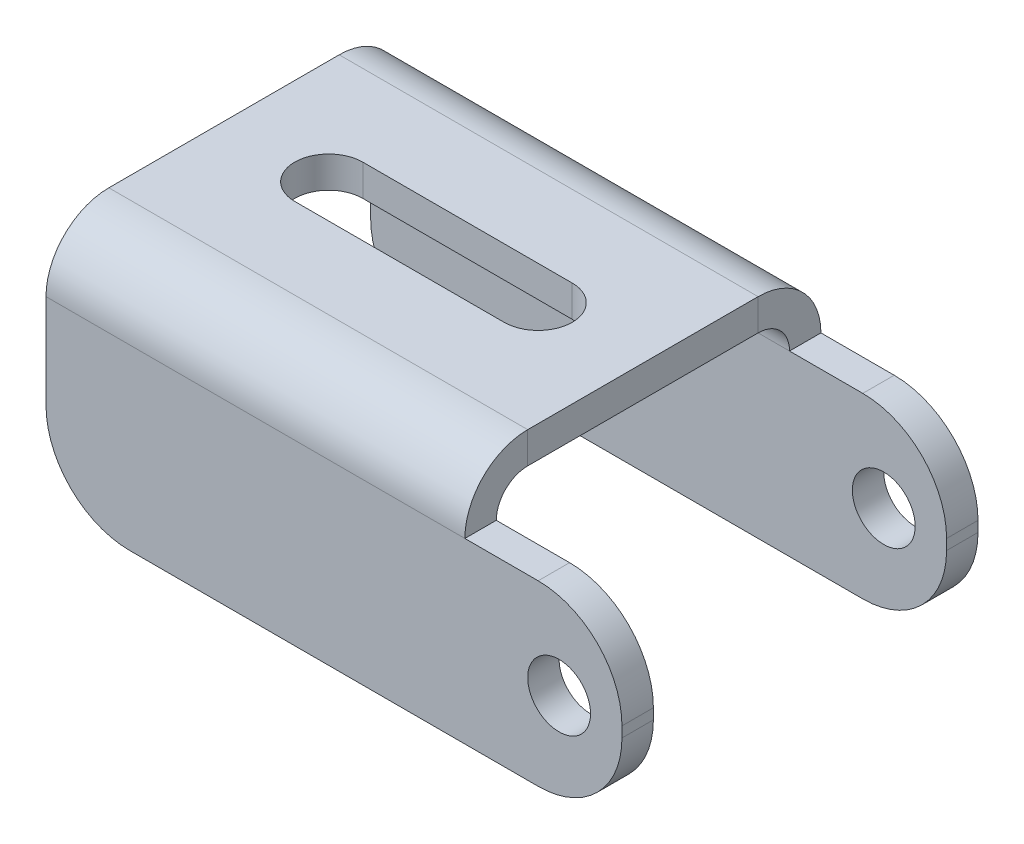
ISO-10303-21;
HEADER;
FILE_DESCRIPTION(('STEP AP214'),'2;1');
FILE_NAME('part.step','',(''),(''),'','','');
FILE_SCHEMA(('AUTOMOTIVE_DESIGN { 1 0 10303 214 1 1 1 1 }'));
ENDSEC;
DATA;
#1=APPLICATION_CONTEXT('core data for automotive mechanical design processes');
#2=APPLICATION_PROTOCOL_DEFINITION('international standard','automotive_design',2000,#1);
#3=PRODUCT_CONTEXT('',#1,'mechanical');
#4=PRODUCT('Part','Part','',(#3));
#5=PRODUCT_RELATED_PRODUCT_CATEGORY('part','',(#4));
#6=PRODUCT_DEFINITION_FORMATION('','',#4);
#7=PRODUCT_DEFINITION_CONTEXT('part definition',#1,'design');
#8=PRODUCT_DEFINITION('design','',#6,#7);
#9=PRODUCT_DEFINITION_SHAPE('','',#8);
#10=(LENGTH_UNIT() NAMED_UNIT(*) SI_UNIT(.MILLI.,.METRE.));
#11=(NAMED_UNIT(*) PLANE_ANGLE_UNIT() SI_UNIT($,.RADIAN.));
#12=(NAMED_UNIT(*) SI_UNIT($,.STERADIAN.) SOLID_ANGLE_UNIT());
#13=UNCERTAINTY_MEASURE_WITH_UNIT(LENGTH_MEASURE(1.E-05),#10,'distance_accuracy_value','');
#14=(GEOMETRIC_REPRESENTATION_CONTEXT(3) GLOBAL_UNCERTAINTY_ASSIGNED_CONTEXT((#13)) GLOBAL_UNIT_ASSIGNED_CONTEXT((#10,
#11,#12)) REPRESENTATION_CONTEXT('',''));
#15=CARTESIAN_POINT('',(0.,0.,0.));
#16=DIRECTION('',(0.,0.,1.));
#17=DIRECTION('',(1.,0.,0.));
#18=AXIS2_PLACEMENT_3D('',#15,#16,#17);
#19=CARTESIAN_POINT('',(55.,17.,-11.));
#20=DIRECTION('',(-1.,0.,0.));
#21=DIRECTION('',(0.,0.,1.));
#22=AXIS2_PLACEMENT_3D('',#19,#20,#21);
#23=CYLINDRICAL_SURFACE('',#22,6.);
#24=DIRECTION('',(-1.,0.,0.));
#25=VECTOR('',#24,1.);
#26=CARTESIAN_POINT('',(55.,23.,-11.));
#27=LINE('',#26,#25);
#28=CARTESIAN_POINT('',(40.,23.,-11.));
#29=VERTEX_POINT('',#28);
#30=CARTESIAN_POINT('',(0.,23.,-11.));
#31=VERTEX_POINT('',#30);
#32=EDGE_CURVE('E337',#29,#31,#27,.T.);
#33=ORIENTED_EDGE('',*,*,#32,.F.);
#34=CARTESIAN_POINT('',(40.,17.,-11.));
#35=DIRECTION('',(-1.,0.,0.));
#36=DIRECTION('',(0.,0.,1.));
#37=AXIS2_PLACEMENT_3D('',#34,#35,#36);
#38=CIRCLE('',#37,6.);
#39=CARTESIAN_POINT('',(40.,17.,-17.));
#40=VERTEX_POINT('',#39);
#41=EDGE_CURVE('E253',#40,#29,#38,.F.);
#42=ORIENTED_EDGE('',*,*,#41,.F.);
#43=DIRECTION('',(-1.,0.,0.));
#44=VECTOR('',#43,1.);
#45=CARTESIAN_POINT('',(55.,17.,-17.));
#46=LINE('',#45,#44);
#47=CARTESIAN_POINT('',(0.,17.,-17.));
#48=VERTEX_POINT('',#47);
#49=EDGE_CURVE('E339',#40,#48,#46,.T.);
#50=ORIENTED_EDGE('',*,*,#49,.T.);
#51=CARTESIAN_POINT('',(0.,17.,-11.));
#52=DIRECTION('',(1.,0.,0.));
#53=DIRECTION('',(0.,0.,-1.));
#54=AXIS2_PLACEMENT_3D('',#51,#52,#53);
#55=CIRCLE('',#54,6.);
#56=EDGE_CURVE('E298',#31,#48,#55,.F.);
#57=ORIENTED_EDGE('',*,*,#56,.F.);
#58=EDGE_LOOP('',(#33,#42,#50,#57));
#59=FACE_BOUND('',#58,.T.);
#60=ADVANCED_FACE('F36',(#59),#23,.T.);
#61=CARTESIAN_POINT('',(55.,23.,14.));
#62=DIRECTION('',(0.,1.,0.));
#63=DIRECTION('',(0.,0.,1.));
#64=AXIS2_PLACEMENT_3D('',#61,#62,#63);
#65=PLANE('',#64);
#66=CARTESIAN_POINT('',(10.,23.,0.));
#67=DIRECTION('',(0.,-1.,0.));
#68=DIRECTION('',(0.,0.,-1.));
#69=AXIS2_PLACEMENT_3D('',#66,#67,#68);
#70=CIRCLE('',#69,3.25);
#71=CARTESIAN_POINT('',(10.,23.,3.25));
#72=VERTEX_POINT('',#71);
#73=CARTESIAN_POINT('',(10.,23.,-3.25));
#74=VERTEX_POINT('',#73);
#75=EDGE_CURVE('E201',#72,#74,#70,.T.);
#76=ORIENTED_EDGE('',*,*,#75,.T.);
#77=DIRECTION('',(1.,0.,0.));
#78=VECTOR('',#77,1.);
#79=CARTESIAN_POINT('',(10.,23.,-3.25));
#80=LINE('',#79,#78);
#81=CARTESIAN_POINT('',(30.,23.,-3.25));
#82=VERTEX_POINT('',#81);
#83=EDGE_CURVE('E213',#74,#82,#80,.T.);
#84=ORIENTED_EDGE('',*,*,#83,.T.);
#85=CARTESIAN_POINT('',(30.,23.,0.));
#86=DIRECTION('',(0.,-1.,0.));
#87=DIRECTION('',(0.,0.,-1.));
#88=AXIS2_PLACEMENT_3D('',#85,#86,#87);
#89=CIRCLE('',#88,3.25);
#90=CARTESIAN_POINT('',(30.,23.,3.25));
#91=VERTEX_POINT('',#90);
#92=EDGE_CURVE('E217',#82,#91,#89,.T.);
#93=ORIENTED_EDGE('',*,*,#92,.T.);
#94=DIRECTION('',(-1.,0.,0.));
#95=VECTOR('',#94,1.);
#96=CARTESIAN_POINT('',(10.,23.,3.25));
#97=LINE('',#96,#95);
#98=EDGE_CURVE('E209',#91,#72,#97,.T.);
#99=ORIENTED_EDGE('',*,*,#98,.T.);
#100=EDGE_LOOP('',(#76,#84,#93,#99));
#101=FACE_BOUND('',#100,.T.);
#102=DIRECTION('',(-1.,0.,0.));
#103=VECTOR('',#102,1.);
#104=CARTESIAN_POINT('',(55.,23.,11.));
#105=LINE('',#104,#103);
#106=CARTESIAN_POINT('',(40.,23.,11.));
#107=VERTEX_POINT('',#106);
#108=CARTESIAN_POINT('',(0.,23.,11.));
#109=VERTEX_POINT('',#108);
#110=EDGE_CURVE('E335',#107,#109,#105,.T.);
#111=ORIENTED_EDGE('',*,*,#110,.F.);
#112=DIRECTION('',(0.,0.,1.));
#113=VECTOR('',#112,1.);
#114=CARTESIAN_POINT('',(40.,23.,14.));
#115=LINE('',#114,#113);
#116=EDGE_CURVE('E268',#29,#107,#115,.T.);
#117=ORIENTED_EDGE('',*,*,#116,.F.);
#118=ORIENTED_EDGE('',*,*,#32,.T.);
#119=DIRECTION('',(0.,0.,-1.));
#120=VECTOR('',#119,1.);
#121=CARTESIAN_POINT('',(0.,23.,14.));
#122=LINE('',#121,#120);
#123=EDGE_CURVE('E301',#109,#31,#122,.T.);
#124=ORIENTED_EDGE('',*,*,#123,.F.);
#125=EDGE_LOOP('',(#111,#117,#118,#124));
#126=FACE_BOUND('',#125,.T.);
#127=ADVANCED_FACE('F219',(#101,#126),#65,.T.);
#128=CARTESIAN_POINT('',(55.,17.,11.));
#129=DIRECTION('',(-1.,0.,0.));
#130=DIRECTION('',(0.,0.,1.));
#131=AXIS2_PLACEMENT_3D('',#128,#129,#130);
#132=CYLINDRICAL_SURFACE('',#131,6.);
#133=DIRECTION('',(-1.,0.,0.));
#134=VECTOR('',#133,1.);
#135=CARTESIAN_POINT('',(55.,17.,17.));
#136=LINE('',#135,#134);
#137=CARTESIAN_POINT('',(40.,17.,17.));
#138=VERTEX_POINT('',#137);
#139=CARTESIAN_POINT('',(0.,17.,17.));
#140=VERTEX_POINT('',#139);
#141=EDGE_CURVE('E332',#138,#140,#136,.T.);
#142=ORIENTED_EDGE('',*,*,#141,.F.);
#143=CARTESIAN_POINT('',(40.,17.,11.));
#144=DIRECTION('',(-1.,0.,0.));
#145=DIRECTION('',(0.,0.,1.));
#146=AXIS2_PLACEMENT_3D('',#143,#144,#145);
#147=CIRCLE('',#146,6.);
#148=EDGE_CURVE('E261',#107,#138,#147,.F.);
#149=ORIENTED_EDGE('',*,*,#148,.F.);
#150=ORIENTED_EDGE('',*,*,#110,.T.);
#151=CARTESIAN_POINT('',(0.,17.,11.));
#152=DIRECTION('',(1.,0.,0.));
#153=DIRECTION('',(0.,0.,-1.));
#154=AXIS2_PLACEMENT_3D('',#151,#152,#153);
#155=CIRCLE('',#154,6.);
#156=EDGE_CURVE('E304',#140,#109,#155,.F.);
#157=ORIENTED_EDGE('',*,*,#156,.F.);
#158=EDGE_LOOP('',(#142,#149,#150,#157));
#159=FACE_BOUND('',#158,.T.);
#160=ADVANCED_FACE('F428',(#159),#132,.T.);
#161=CARTESIAN_POINT('',(55.,17.,11.));
#162=DIRECTION('',(-1.,0.,0.));
#163=DIRECTION('',(0.,0.,1.));
#164=AXIS2_PLACEMENT_3D('',#161,#162,#163);
#165=CYLINDRICAL_SURFACE('',#164,3.);
#166=CARTESIAN_POINT('',(40.,17.,11.));
#167=DIRECTION('',(-1.,0.,0.));
#168=DIRECTION('',(0.,0.,1.));
#169=AXIS2_PLACEMENT_3D('',#166,#167,#168);
#170=CIRCLE('',#169,3.);
#171=CARTESIAN_POINT('',(40.,20.,11.));
#172=VERTEX_POINT('',#171);
#173=CARTESIAN_POINT('',(40.,17.,14.));
#174=VERTEX_POINT('',#173);
#175=EDGE_CURVE('E262',#172,#174,#170,.F.);
#176=ORIENTED_EDGE('',*,*,#175,.T.);
#177=DIRECTION('',(-1.,0.,0.));
#178=VECTOR('',#177,1.);
#179=CARTESIAN_POINT('',(55.,17.,14.));
#180=LINE('',#179,#178);
#181=CARTESIAN_POINT('',(0.,17.,14.));
#182=VERTEX_POINT('',#181);
#183=EDGE_CURVE('E325',#174,#182,#180,.T.);
#184=ORIENTED_EDGE('',*,*,#183,.T.);
#185=CARTESIAN_POINT('',(0.,17.,11.));
#186=DIRECTION('',(1.,0.,0.));
#187=DIRECTION('',(0.,0.,-1.));
#188=AXIS2_PLACEMENT_3D('',#185,#186,#187);
#189=CIRCLE('',#188,3.);
#190=CARTESIAN_POINT('',(0.,20.,11.));
#191=VERTEX_POINT('',#190);
#192=EDGE_CURVE('E311',#182,#191,#189,.F.);
#193=ORIENTED_EDGE('',*,*,#192,.T.);
#194=DIRECTION('',(-1.,0.,0.));
#195=VECTOR('',#194,1.);
#196=CARTESIAN_POINT('',(55.,20.,11.));
#197=LINE('',#196,#195);
#198=EDGE_CURVE('E323',#172,#191,#197,.T.);
#199=ORIENTED_EDGE('',*,*,#198,.F.);
#200=EDGE_LOOP('',(#176,#184,#193,#199));
#201=FACE_BOUND('',#200,.T.);
#202=ADVANCED_FACE('F471',(#201),#165,.F.);
#203=CARTESIAN_POINT('',(55.,20.,14.));
#204=DIRECTION('',(0.,1.,0.));
#205=DIRECTION('',(0.,0.,1.));
#206=AXIS2_PLACEMENT_3D('',#203,#204,#205);
#207=PLANE('',#206);
#208=DIRECTION('',(1.,0.,0.));
#209=VECTOR('',#208,1.);
#210=CARTESIAN_POINT('',(10.,20.,-3.25));
#211=LINE('',#210,#209);
#212=CARTESIAN_POINT('',(10.,20.,-3.25));
#213=VERTEX_POINT('',#212);
#214=CARTESIAN_POINT('',(30.,20.,-3.25));
#215=VERTEX_POINT('',#214);
#216=EDGE_CURVE('E231',#213,#215,#211,.T.);
#217=ORIENTED_EDGE('',*,*,#216,.F.);
#218=CARTESIAN_POINT('',(10.,20.,0.));
#219=DIRECTION('',(0.,-1.,0.));
#220=DIRECTION('',(0.,0.,-1.));
#221=AXIS2_PLACEMENT_3D('',#218,#219,#220);
#222=CIRCLE('',#221,3.25);
#223=CARTESIAN_POINT('',(10.,20.,3.25));
#224=VERTEX_POINT('',#223);
#225=EDGE_CURVE('E204',#224,#213,#222,.T.);
#226=ORIENTED_EDGE('',*,*,#225,.F.);
#227=DIRECTION('',(-1.,0.,0.));
#228=VECTOR('',#227,1.);
#229=CARTESIAN_POINT('',(10.,20.,3.25));
#230=LINE('',#229,#228);
#231=CARTESIAN_POINT('',(30.,20.,3.25));
#232=VERTEX_POINT('',#231);
#233=EDGE_CURVE('E222',#232,#224,#230,.T.);
#234=ORIENTED_EDGE('',*,*,#233,.F.);
#235=CARTESIAN_POINT('',(30.,20.,0.));
#236=DIRECTION('',(0.,-1.,0.));
#237=DIRECTION('',(0.,0.,-1.));
#238=AXIS2_PLACEMENT_3D('',#235,#236,#237);
#239=CIRCLE('',#238,3.25);
#240=EDGE_CURVE('E225',#215,#232,#239,.T.);
#241=ORIENTED_EDGE('',*,*,#240,.F.);
#242=EDGE_LOOP('',(#217,#226,#234,#241));
#243=FACE_BOUND('',#242,.T.);
#244=DIRECTION('',(0.,0.,1.));
#245=VECTOR('',#244,1.);
#246=CARTESIAN_POINT('',(40.,20.,14.));
#247=LINE('',#246,#245);
#248=CARTESIAN_POINT('',(40.,20.,-11.));
#249=VERTEX_POINT('',#248);
#250=EDGE_CURVE('E265',#249,#172,#247,.T.);
#251=ORIENTED_EDGE('',*,*,#250,.T.);
#252=ORIENTED_EDGE('',*,*,#198,.T.);
#253=DIRECTION('',(0.,0.,-1.));
#254=VECTOR('',#253,1.);
#255=CARTESIAN_POINT('',(0.,20.,14.));
#256=LINE('',#255,#254);
#257=CARTESIAN_POINT('',(0.,20.,-11.));
#258=VERTEX_POINT('',#257);
#259=EDGE_CURVE('E314',#191,#258,#256,.T.);
#260=ORIENTED_EDGE('',*,*,#259,.T.);
#261=DIRECTION('',(-1.,0.,0.));
#262=VECTOR('',#261,1.);
#263=CARTESIAN_POINT('',(55.,20.,-11.));
#264=LINE('',#263,#262);
#265=EDGE_CURVE('E321',#249,#258,#264,.T.);
#266=ORIENTED_EDGE('',*,*,#265,.F.);
#267=EDGE_LOOP('',(#251,#252,#260,#266));
#268=FACE_BOUND('',#267,.T.);
#269=ADVANCED_FACE('F468',(#243,#268),#207,.F.);
#270=CARTESIAN_POINT('',(55.,17.,-11.));
#271=DIRECTION('',(-1.,0.,0.));
#272=DIRECTION('',(0.,0.,1.));
#273=AXIS2_PLACEMENT_3D('',#270,#271,#272);
#274=CYLINDRICAL_SURFACE('',#273,3.);
#275=CARTESIAN_POINT('',(40.,17.,-11.));
#276=DIRECTION('',(-1.,0.,0.));
#277=DIRECTION('',(0.,0.,1.));
#278=AXIS2_PLACEMENT_3D('',#275,#276,#277);
#279=CIRCLE('',#278,3.);
#280=CARTESIAN_POINT('',(40.,17.,-14.));
#281=VERTEX_POINT('',#280);
#282=EDGE_CURVE('E254',#281,#249,#279,.F.);
#283=ORIENTED_EDGE('',*,*,#282,.T.);
#284=ORIENTED_EDGE('',*,*,#265,.T.);
#285=CARTESIAN_POINT('',(0.,17.,-11.));
#286=DIRECTION('',(1.,0.,0.));
#287=DIRECTION('',(0.,0.,-1.));
#288=AXIS2_PLACEMENT_3D('',#285,#286,#287);
#289=CIRCLE('',#288,3.);
#290=CARTESIAN_POINT('',(0.,17.,-14.));
#291=VERTEX_POINT('',#290);
#292=EDGE_CURVE('E283',#258,#291,#289,.F.);
#293=ORIENTED_EDGE('',*,*,#292,.T.);
#294=DIRECTION('',(-1.,0.,0.));
#295=VECTOR('',#294,1.);
#296=CARTESIAN_POINT('',(55.,17.,-14.));
#297=LINE('',#296,#295);
#298=EDGE_CURVE('E292',#281,#291,#297,.T.);
#299=ORIENTED_EDGE('',*,*,#298,.F.);
#300=EDGE_LOOP('',(#283,#284,#293,#299));
#301=FACE_BOUND('',#300,.T.);
#302=ADVANCED_FACE('F465',(#301),#274,.F.);
#303=CARTESIAN_POINT('',(55.,23.,11.));
#304=DIRECTION('',(1.,0.,0.));
#305=DIRECTION('',(0.,0.,-1.));
#306=AXIS2_PLACEMENT_3D('',#303,#304,#305);
#307=PLANE('',#306);
#308=DIRECTION('',(0.,1.,0.));
#309=VECTOR('',#308,1.);
#310=CARTESIAN_POINT('',(55.,0.,17.));
#311=LINE('',#310,#309);
#312=CARTESIAN_POINT('',(55.,8.,17.));
#313=VERTEX_POINT('',#312);
#314=CARTESIAN_POINT('',(55.,9.,17.));
#315=VERTEX_POINT('',#314);
#316=EDGE_CURVE('E286',#313,#315,#311,.T.);
#317=ORIENTED_EDGE('',*,*,#316,.F.);
#318=DIRECTION('',(0.,0.,1.));
#319=VECTOR('',#318,1.);
#320=CARTESIAN_POINT('',(55.,8.,11.));
#321=LINE('',#320,#319);
#322=CARTESIAN_POINT('',(55.,8.,14.));
#323=VERTEX_POINT('',#322);
#324=EDGE_CURVE('E390',#313,#323,#321,.F.);
#325=ORIENTED_EDGE('',*,*,#324,.T.);
#326=DIRECTION('',(0.,1.,0.));
#327=VECTOR('',#326,1.);
#328=CARTESIAN_POINT('',(55.,0.,14.));
#329=LINE('',#328,#327);
#330=CARTESIAN_POINT('',(55.,9.,14.));
#331=VERTEX_POINT('',#330);
#332=EDGE_CURVE('E289',#323,#331,#329,.T.);
#333=ORIENTED_EDGE('',*,*,#332,.T.);
#334=DIRECTION('',(0.,0.,1.));
#335=VECTOR('',#334,1.);
#336=CARTESIAN_POINT('',(55.,9.,11.));
#337=LINE('',#336,#335);
#338=EDGE_CURVE('E387',#331,#315,#337,.T.);
#339=ORIENTED_EDGE('',*,*,#338,.T.);
#340=EDGE_LOOP('',(#317,#325,#333,#339));
#341=FACE_BOUND('',#340,.T.);
#342=ADVANCED_FACE('F509',(#341),#307,.T.);
#343=CARTESIAN_POINT('',(0.,20.,11.));
#344=DIRECTION('',(-1.,0.,0.));
#345=DIRECTION('',(0.,0.,1.));
#346=AXIS2_PLACEMENT_3D('',#343,#344,#345);
#347=PLANE('',#346);
#348=DIRECTION('',(0.,1.,0.));
#349=VECTOR('',#348,1.);
#350=CARTESIAN_POINT('',(0.,20.,11.));
#351=LINE('',#350,#349);
#352=EDGE_CURVE('E357',#191,#109,#351,.T.);
#353=ORIENTED_EDGE('',*,*,#352,.F.);
#354=ORIENTED_EDGE('',*,*,#192,.F.);
#355=DIRECTION('',(0.,0.,-1.));
#356=VECTOR('',#355,1.);
#357=CARTESIAN_POINT('',(0.,17.,17.));
#358=LINE('',#357,#356);
#359=EDGE_CURVE('E354',#140,#182,#358,.T.);
#360=ORIENTED_EDGE('',*,*,#359,.F.);
#361=ORIENTED_EDGE('',*,*,#156,.T.);
#362=EDGE_LOOP('',(#353,#354,#360,#361));
#363=FACE_BOUND('',#362,.T.);
#364=ADVANCED_FACE('F427',(#363),#347,.T.);
#365=CARTESIAN_POINT('',(0.,17.,17.));
#366=DIRECTION('',(-1.,0.,0.));
#367=DIRECTION('',(0.,0.,1.));
#368=AXIS2_PLACEMENT_3D('',#365,#366,#367);
#369=PLANE('',#368);
#370=ORIENTED_EDGE('',*,*,#259,.F.);
#371=ORIENTED_EDGE('',*,*,#352,.T.);
#372=ORIENTED_EDGE('',*,*,#123,.T.);
#373=DIRECTION('',(0.,-1.,0.));
#374=VECTOR('',#373,1.);
#375=CARTESIAN_POINT('',(0.,23.,-11.));
#376=LINE('',#375,#374);
#377=EDGE_CURVE('E348',#31,#258,#376,.T.);
#378=ORIENTED_EDGE('',*,*,#377,.T.);
#379=EDGE_LOOP('',(#370,#371,#372,#378));
#380=FACE_BOUND('',#379,.T.);
#381=ADVANCED_FACE('F434',(#380),#369,.T.);
#382=CARTESIAN_POINT('',(0.,17.,-14.));
#383=DIRECTION('',(-1.,0.,0.));
#384=DIRECTION('',(0.,0.,1.));
#385=AXIS2_PLACEMENT_3D('',#382,#383,#384);
#386=PLANE('',#385);
#387=DIRECTION('',(0.,0.,-1.));
#388=VECTOR('',#387,1.);
#389=CARTESIAN_POINT('',(0.,17.,-14.));
#390=LINE('',#389,#388);
#391=EDGE_CURVE('E351',#291,#48,#390,.T.);
#392=ORIENTED_EDGE('',*,*,#391,.F.);
#393=ORIENTED_EDGE('',*,*,#292,.F.);
#394=ORIENTED_EDGE('',*,*,#377,.F.);
#395=ORIENTED_EDGE('',*,*,#56,.T.);
#396=EDGE_LOOP('',(#392,#393,#394,#395));
#397=FACE_BOUND('',#396,.T.);
#398=ADVANCED_FACE('F443',(#397),#386,.T.);
#399=CARTESIAN_POINT('',(0.,23.,-11.));
#400=DIRECTION('',(-1.,0.,0.));
#401=DIRECTION('',(0.,0.,1.));
#402=AXIS2_PLACEMENT_3D('',#399,#400,#401);
#403=PLANE('',#402);
#404=DIRECTION('',(0.,-1.,0.));
#405=VECTOR('',#404,1.);
#406=CARTESIAN_POINT('',(0.,20.,-17.));
#407=LINE('',#406,#405);
#408=CARTESIAN_POINT('',(0.,8.,-17.));
#409=VERTEX_POINT('',#408);
#410=EDGE_CURVE('E295',#48,#409,#407,.T.);
#411=ORIENTED_EDGE('',*,*,#410,.T.);
#412=DIRECTION('',(0.,0.,1.));
#413=VECTOR('',#412,1.);
#414=CARTESIAN_POINT('',(0.,8.,-11.));
#415=LINE('',#414,#413);
#416=CARTESIAN_POINT('',(0.,8.,-14.));
#417=VERTEX_POINT('',#416);
#418=EDGE_CURVE('E398',#409,#417,#415,.T.);
#419=ORIENTED_EDGE('',*,*,#418,.T.);
#420=DIRECTION('',(0.,-1.,0.));
#421=VECTOR('',#420,1.);
#422=CARTESIAN_POINT('',(0.,20.,-14.));
#423=LINE('',#422,#421);
#424=EDGE_CURVE('E276',#291,#417,#423,.T.);
#425=ORIENTED_EDGE('',*,*,#424,.F.);
#426=ORIENTED_EDGE('',*,*,#391,.T.);
#427=EDGE_LOOP('',(#411,#419,#425,#426));
#428=FACE_BOUND('',#427,.T.);
#429=ADVANCED_FACE('F450',(#428),#403,.T.);
#430=CARTESIAN_POINT('',(55.,20.,-14.));
#431=DIRECTION('',(0.,0.,-1.));
#432=DIRECTION('',(0.,1.,0.));
#433=AXIS2_PLACEMENT_3D('',#430,#431,#432);
#434=PLANE('',#433);
#435=CARTESIAN_POINT('',(49.,8.50000000000001,-14.));
#436=DIRECTION('',(0.,0.,-1.));
#437=DIRECTION('',(0.,1.,0.));
#438=AXIS2_PLACEMENT_3D('',#435,#436,#437);
#439=CIRCLE('',#438,2.99999999999999);
#440=CARTESIAN_POINT('',(49.,11.5,-14.));
#441=VERTEX_POINT('',#440);
#442=EDGE_CURVE('E247',#441,#441,#439,.T.);
#443=ORIENTED_EDGE('',*,*,#442,.T.);
#444=EDGE_LOOP('',(#443));
#445=FACE_BOUND('',#444,.T.);
#446=ORIENTED_EDGE('',*,*,#424,.T.);
#447=CARTESIAN_POINT('',(8.,8.,-14.));
#448=DIRECTION('',(0.,0.,-1.));
#449=DIRECTION('',(0.,1.,0.));
#450=AXIS2_PLACEMENT_3D('',#447,#448,#449);
#451=CIRCLE('',#450,8.);
#452=CARTESIAN_POINT('',(8.,0.,-14.));
#453=VERTEX_POINT('',#452);
#454=EDGE_CURVE('E401',#417,#453,#451,.F.);
#455=ORIENTED_EDGE('',*,*,#454,.T.);
#456=DIRECTION('',(-1.,0.,0.));
#457=VECTOR('',#456,1.);
#458=CARTESIAN_POINT('',(55.,0.,-14.));
#459=LINE('',#458,#457);
#460=CARTESIAN_POINT('',(47.,0.,-14.));
#461=VERTEX_POINT('',#460);
#462=EDGE_CURVE('E345',#461,#453,#459,.T.);
#463=ORIENTED_EDGE('',*,*,#462,.F.);
#464=CARTESIAN_POINT('',(47.,8.,-14.));
#465=DIRECTION('',(0.,0.,-1.));
#466=DIRECTION('',(0.,1.,0.));
#467=AXIS2_PLACEMENT_3D('',#464,#465,#466);
#468=CIRCLE('',#467,8.);
#469=CARTESIAN_POINT('',(55.,8.,-14.));
#470=VERTEX_POINT('',#469);
#471=EDGE_CURVE('E367',#461,#470,#468,.F.);
#472=ORIENTED_EDGE('',*,*,#471,.T.);
#473=DIRECTION('',(0.,-1.,0.));
#474=VECTOR('',#473,1.);
#475=CARTESIAN_POINT('',(55.,20.,-14.));
#476=LINE('',#475,#474);
#477=CARTESIAN_POINT('',(55.,9.,-14.));
#478=VERTEX_POINT('',#477);
#479=EDGE_CURVE('E279',#478,#470,#476,.T.);
#480=ORIENTED_EDGE('',*,*,#479,.F.);
#481=CARTESIAN_POINT('',(47.,9.,-14.));
#482=DIRECTION('',(0.,0.,-1.));
#483=DIRECTION('',(0.,1.,0.));
#484=AXIS2_PLACEMENT_3D('',#481,#482,#483);
#485=CIRCLE('',#484,8.);
#486=CARTESIAN_POINT('',(47.,17.,-14.));
#487=VERTEX_POINT('',#486);
#488=EDGE_CURVE('E365',#478,#487,#485,.F.);
#489=ORIENTED_EDGE('',*,*,#488,.T.);
#490=EDGE_CURVE('E319',#487,#281,#297,.T.);
#491=ORIENTED_EDGE('',*,*,#490,.T.);
#492=ORIENTED_EDGE('',*,*,#298,.T.);
#493=EDGE_LOOP('',(#446,#455,#463,#472,#480,#489,#491,#492));
#494=FACE_BOUND('',#493,.T.);
#495=ADVANCED_FACE('F459',(#445,#494),#434,.F.);
#496=CARTESIAN_POINT('',(55.,0.,-17.));
#497=DIRECTION('',(0.,-1.,0.));
#498=DIRECTION('',(0.,0.,-1.));
#499=AXIS2_PLACEMENT_3D('',#496,#497,#498);
#500=PLANE('',#499);
#501=ORIENTED_EDGE('',*,*,#462,.T.);
#502=DIRECTION('',(0.,0.,1.));
#503=VECTOR('',#502,1.);
#504=CARTESIAN_POINT('',(8.,0.,-17.));
#505=LINE('',#504,#503);
#506=CARTESIAN_POINT('',(8.,0.,-17.));
#507=VERTEX_POINT('',#506);
#508=EDGE_CURVE('E403',#453,#507,#505,.F.);
#509=ORIENTED_EDGE('',*,*,#508,.T.);
#510=DIRECTION('',(-1.,0.,0.));
#511=VECTOR('',#510,1.);
#512=CARTESIAN_POINT('',(55.,0.,-17.));
#513=LINE('',#512,#511);
#514=CARTESIAN_POINT('',(47.,0.,-17.));
#515=VERTEX_POINT('',#514);
#516=EDGE_CURVE('E342',#515,#507,#513,.T.);
#517=ORIENTED_EDGE('',*,*,#516,.F.);
#518=DIRECTION('',(0.,0.,1.));
#519=VECTOR('',#518,1.);
#520=CARTESIAN_POINT('',(47.,0.,-17.));
#521=LINE('',#520,#519);
#522=EDGE_CURVE('E360',#515,#461,#521,.T.);
#523=ORIENTED_EDGE('',*,*,#522,.T.);
#524=EDGE_LOOP('',(#501,#509,#517,#523));
#525=FACE_BOUND('',#524,.T.);
#526=ADVANCED_FACE('F493',(#525),#500,.T.);
#527=CARTESIAN_POINT('',(55.,20.,-17.));
#528=DIRECTION('',(0.,0.,-1.));
#529=DIRECTION('',(0.,1.,0.));
#530=AXIS2_PLACEMENT_3D('',#527,#528,#529);
#531=PLANE('',#530);
#532=CARTESIAN_POINT('',(49.,8.50000000000001,-17.));
#533=DIRECTION('',(0.,0.,1.));
#534=DIRECTION('',(1.,0.,0.));
#535=AXIS2_PLACEMENT_3D('',#532,#533,#534);
#536=CIRCLE('',#535,2.99999999999999);
#537=CARTESIAN_POINT('',(52.,8.50000000000001,-17.));
#538=VERTEX_POINT('',#537);
#539=EDGE_CURVE('E243',#538,#538,#536,.T.);
#540=ORIENTED_EDGE('',*,*,#539,.T.);
#541=EDGE_LOOP('',(#540));
#542=FACE_BOUND('',#541,.T.);
#543=ORIENTED_EDGE('',*,*,#516,.T.);
#544=CARTESIAN_POINT('',(8.,8.,-17.));
#545=DIRECTION('',(0.,0.,-1.));
#546=DIRECTION('',(0.,1.,0.));
#547=AXIS2_PLACEMENT_3D('',#544,#545,#546);
#548=CIRCLE('',#547,8.);
#549=EDGE_CURVE('E405',#507,#409,#548,.T.);
#550=ORIENTED_EDGE('',*,*,#549,.T.);
#551=ORIENTED_EDGE('',*,*,#410,.F.);
#552=ORIENTED_EDGE('',*,*,#49,.F.);
#553=CARTESIAN_POINT('',(47.,17.,-17.));
#554=VERTEX_POINT('',#553);
#555=EDGE_CURVE('E340',#554,#40,#46,.T.);
#556=ORIENTED_EDGE('',*,*,#555,.F.);
#557=CARTESIAN_POINT('',(47.,9.,-17.));
#558=DIRECTION('',(0.,0.,-1.));
#559=DIRECTION('',(0.,1.,0.));
#560=AXIS2_PLACEMENT_3D('',#557,#558,#559);
#561=CIRCLE('',#560,8.);
#562=CARTESIAN_POINT('',(55.,9.,-17.));
#563=VERTEX_POINT('',#562);
#564=EDGE_CURVE('E374',#554,#563,#561,.T.);
#565=ORIENTED_EDGE('',*,*,#564,.T.);
#566=DIRECTION('',(0.,-1.,0.));
#567=VECTOR('',#566,1.);
#568=CARTESIAN_POINT('',(55.,20.,-17.));
#569=LINE('',#568,#567);
#570=CARTESIAN_POINT('',(55.,8.,-17.));
#571=VERTEX_POINT('',#570);
#572=EDGE_CURVE('E282',#563,#571,#569,.T.);
#573=ORIENTED_EDGE('',*,*,#572,.T.);
#574=CARTESIAN_POINT('',(47.,8.,-17.));
#575=DIRECTION('',(0.,0.,-1.));
#576=DIRECTION('',(0.,1.,0.));
#577=AXIS2_PLACEMENT_3D('',#574,#575,#576);
#578=CIRCLE('',#577,8.);
#579=EDGE_CURVE('E376',#571,#515,#578,.T.);
#580=ORIENTED_EDGE('',*,*,#579,.T.);
#581=EDGE_LOOP('',(#543,#550,#551,#552,#556,#565,#573,#580));
#582=FACE_BOUND('',#581,.T.);
#583=ADVANCED_FACE('F452',(#542,#582),#531,.T.);
#584=CARTESIAN_POINT('',(55.,0.,17.));
#585=DIRECTION('',(0.,0.,1.));
#586=DIRECTION('',(0.,-1.,0.));
#587=AXIS2_PLACEMENT_3D('',#584,#585,#586);
#588=PLANE('',#587);
#589=CARTESIAN_POINT('',(49.,8.50000000000001,17.));
#590=DIRECTION('',(0.,0.,1.));
#591=DIRECTION('',(1.,0.,0.));
#592=AXIS2_PLACEMENT_3D('',#589,#590,#591);
#593=CIRCLE('',#592,2.99999999999999);
#594=CARTESIAN_POINT('',(52.,8.50000000000001,17.));
#595=VERTEX_POINT('',#594);
#596=EDGE_CURVE('E237',#595,#595,#593,.T.);
#597=ORIENTED_EDGE('',*,*,#596,.F.);
#598=EDGE_LOOP('',(#597));
#599=FACE_BOUND('',#598,.T.);
#600=DIRECTION('',(0.,1.,0.));
#601=VECTOR('',#600,1.);
#602=CARTESIAN_POINT('',(0.,0.,17.));
#603=LINE('',#602,#601);
#604=CARTESIAN_POINT('',(0.,8.,17.));
#605=VERTEX_POINT('',#604);
#606=EDGE_CURVE('E307',#605,#140,#603,.T.);
#607=ORIENTED_EDGE('',*,*,#606,.F.);
#608=CARTESIAN_POINT('',(8.,8.,17.));
#609=DIRECTION('',(0.,0.,1.));
#610=DIRECTION('',(0.,-1.,0.));
#611=AXIS2_PLACEMENT_3D('',#608,#609,#610);
#612=CIRCLE('',#611,8.);
#613=CARTESIAN_POINT('',(8.,0.,17.));
#614=VERTEX_POINT('',#613);
#615=EDGE_CURVE('E58',#605,#614,#612,.T.);
#616=ORIENTED_EDGE('',*,*,#615,.T.);
#617=DIRECTION('',(-1.,0.,0.));
#618=VECTOR('',#617,1.);
#619=CARTESIAN_POINT('',(55.,0.,17.));
#620=LINE('',#619,#618);
#621=CARTESIAN_POINT('',(47.,0.,17.));
#622=VERTEX_POINT('',#621);
#623=EDGE_CURVE('E330',#622,#614,#620,.T.);
#624=ORIENTED_EDGE('',*,*,#623,.F.);
#625=CARTESIAN_POINT('',(47.,8.,17.));
#626=DIRECTION('',(0.,0.,1.));
#627=DIRECTION('',(0.,-1.,0.));
#628=AXIS2_PLACEMENT_3D('',#625,#626,#627);
#629=CIRCLE('',#628,8.);
#630=EDGE_CURVE('E385',#622,#313,#629,.T.);
#631=ORIENTED_EDGE('',*,*,#630,.T.);
#632=ORIENTED_EDGE('',*,*,#316,.T.);
#633=CARTESIAN_POINT('',(47.,9.,17.));
#634=DIRECTION('',(0.,0.,1.));
#635=DIRECTION('',(0.,-1.,0.));
#636=AXIS2_PLACEMENT_3D('',#633,#634,#635);
#637=CIRCLE('',#636,8.);
#638=CARTESIAN_POINT('',(47.,17.,17.));
#639=VERTEX_POINT('',#638);
#640=EDGE_CURVE('E383',#315,#639,#637,.T.);
#641=ORIENTED_EDGE('',*,*,#640,.T.);
#642=EDGE_CURVE('E333',#639,#138,#136,.T.);
#643=ORIENTED_EDGE('',*,*,#642,.T.);
#644=ORIENTED_EDGE('',*,*,#141,.T.);
#645=EDGE_LOOP('',(#607,#616,#624,#631,#632,#641,#643,#644));
#646=FACE_BOUND('',#645,.T.);
#647=ADVANCED_FACE('F417',(#599,#646),#588,.T.);
#648=CARTESIAN_POINT('',(55.,0.,14.));
#649=DIRECTION('',(0.,-1.,0.));
#650=DIRECTION('',(0.,0.,-1.));
#651=AXIS2_PLACEMENT_3D('',#648,#649,#650);
#652=PLANE('',#651);
#653=ORIENTED_EDGE('',*,*,#623,.T.);
#654=DIRECTION('',(0.,0.,1.));
#655=VECTOR('',#654,1.);
#656=CARTESIAN_POINT('',(8.,0.,14.));
#657=LINE('',#656,#655);
#658=CARTESIAN_POINT('',(8.,0.,14.));
#659=VERTEX_POINT('',#658);
#660=EDGE_CURVE('E44',#614,#659,#657,.F.);
#661=ORIENTED_EDGE('',*,*,#660,.T.);
#662=DIRECTION('',(-1.,0.,0.));
#663=VECTOR('',#662,1.);
#664=CARTESIAN_POINT('',(55.,0.,14.));
#665=LINE('',#664,#663);
#666=CARTESIAN_POINT('',(47.,0.,14.));
#667=VERTEX_POINT('',#666);
#668=EDGE_CURVE('E328',#667,#659,#665,.T.);
#669=ORIENTED_EDGE('',*,*,#668,.F.);
#670=DIRECTION('',(0.,0.,1.));
#671=VECTOR('',#670,1.);
#672=CARTESIAN_POINT('',(47.,0.,14.));
#673=LINE('',#672,#671);
#674=EDGE_CURVE('E380',#667,#622,#673,.T.);
#675=ORIENTED_EDGE('',*,*,#674,.T.);
#676=EDGE_LOOP('',(#653,#661,#669,#675));
#677=FACE_BOUND('',#676,.T.);
#678=ADVANCED_FACE('F541',(#677),#652,.T.);
#679=CARTESIAN_POINT('',(55.,0.,14.));
#680=DIRECTION('',(0.,0.,1.));
#681=DIRECTION('',(0.,-1.,0.));
#682=AXIS2_PLACEMENT_3D('',#679,#680,#681);
#683=PLANE('',#682);
#684=CARTESIAN_POINT('',(49.,8.50000000000001,14.));
#685=DIRECTION('',(0.,0.,1.));
#686=DIRECTION('',(0.,-1.,0.));
#687=AXIS2_PLACEMENT_3D('',#684,#685,#686);
#688=CIRCLE('',#687,2.99999999999999);
#689=CARTESIAN_POINT('',(49.,5.50000000000002,14.));
#690=VERTEX_POINT('',#689);
#691=EDGE_CURVE('E246',#690,#690,#688,.T.);
#692=ORIENTED_EDGE('',*,*,#691,.T.);
#693=EDGE_LOOP('',(#692));
#694=FACE_BOUND('',#693,.T.);
#695=ORIENTED_EDGE('',*,*,#668,.T.);
#696=CARTESIAN_POINT('',(8.,8.,14.));
#697=DIRECTION('',(0.,0.,1.));
#698=DIRECTION('',(0.,-1.,0.));
#699=AXIS2_PLACEMENT_3D('',#696,#697,#698);
#700=CIRCLE('',#699,8.);
#701=CARTESIAN_POINT('',(0.,8.,14.));
#702=VERTEX_POINT('',#701);
#703=EDGE_CURVE('E11',#659,#702,#700,.F.);
#704=ORIENTED_EDGE('',*,*,#703,.T.);
#705=DIRECTION('',(0.,1.,0.));
#706=VECTOR('',#705,1.);
#707=CARTESIAN_POINT('',(0.,0.,14.));
#708=LINE('',#707,#706);
#709=EDGE_CURVE('E309',#702,#182,#708,.T.);
#710=ORIENTED_EDGE('',*,*,#709,.T.);
#711=ORIENTED_EDGE('',*,*,#183,.F.);
#712=CARTESIAN_POINT('',(47.,17.,14.));
#713=VERTEX_POINT('',#712);
#714=EDGE_CURVE('E326',#713,#174,#180,.T.);
#715=ORIENTED_EDGE('',*,*,#714,.F.);
#716=CARTESIAN_POINT('',(47.,9.,14.));
#717=DIRECTION('',(0.,0.,1.));
#718=DIRECTION('',(0.,-1.,0.));
#719=AXIS2_PLACEMENT_3D('',#716,#717,#718);
#720=CIRCLE('',#719,8.);
#721=EDGE_CURVE('E392',#713,#331,#720,.F.);
#722=ORIENTED_EDGE('',*,*,#721,.T.);
#723=ORIENTED_EDGE('',*,*,#332,.F.);
#724=CARTESIAN_POINT('',(47.,8.,14.));
#725=DIRECTION('',(0.,0.,1.));
#726=DIRECTION('',(0.,-1.,0.));
#727=AXIS2_PLACEMENT_3D('',#724,#725,#726);
#728=CIRCLE('',#727,8.);
#729=EDGE_CURVE('E394',#323,#667,#728,.F.);
#730=ORIENTED_EDGE('',*,*,#729,.T.);
#731=EDGE_LOOP('',(#695,#704,#710,#711,#715,#722,#723,#730));
#732=FACE_BOUND('',#731,.T.);
#733=ADVANCED_FACE('F477',(#694,#732),#683,.F.);
#734=CARTESIAN_POINT('',(55.,17.,-11.));
#735=DIRECTION('',(1.,0.,0.));
#736=DIRECTION('',(0.,0.,-1.));
#737=AXIS2_PLACEMENT_3D('',#734,#735,#736);
#738=PLANE('',#737);
#739=ORIENTED_EDGE('',*,*,#479,.T.);
#740=DIRECTION('',(0.,0.,1.));
#741=VECTOR('',#740,1.);
#742=CARTESIAN_POINT('',(55.,8.,-11.));
#743=LINE('',#742,#741);
#744=EDGE_CURVE('E372',#470,#571,#743,.F.);
#745=ORIENTED_EDGE('',*,*,#744,.T.);
#746=ORIENTED_EDGE('',*,*,#572,.F.);
#747=DIRECTION('',(0.,0.,-1.));
#748=VECTOR('',#747,1.);
#749=CARTESIAN_POINT('',(55.,9.,-11.));
#750=LINE('',#749,#748);
#751=EDGE_CURVE('E369',#563,#478,#750,.F.);
#752=ORIENTED_EDGE('',*,*,#751,.T.);
#753=EDGE_LOOP('',(#739,#745,#746,#752));
#754=FACE_BOUND('',#753,.T.);
#755=ADVANCED_FACE('F561',(#754),#738,.T.);
#756=CARTESIAN_POINT('',(0.,17.,-11.));
#757=DIRECTION('',(1.,0.,0.));
#758=DIRECTION('',(0.,0.,-1.));
#759=AXIS2_PLACEMENT_3D('',#756,#757,#758);
#760=PLANE('',#759);
#761=ORIENTED_EDGE('',*,*,#709,.F.);
#762=DIRECTION('',(0.,0.,1.));
#763=VECTOR('',#762,1.);
#764=CARTESIAN_POINT('',(0.,8.,17.));
#765=LINE('',#764,#763);
#766=EDGE_CURVE('E407',#702,#605,#765,.T.);
#767=ORIENTED_EDGE('',*,*,#766,.T.);
#768=ORIENTED_EDGE('',*,*,#606,.T.);
#769=ORIENTED_EDGE('',*,*,#359,.T.);
#770=EDGE_LOOP('',(#761,#767,#768,#769));
#771=FACE_BOUND('',#770,.T.);
#772=ADVANCED_FACE('F413',(#771),#760,.F.);
#773=CARTESIAN_POINT('',(40.,20.,14.));
#774=DIRECTION('',(-1.,0.,0.));
#775=DIRECTION('',(0.,0.,1.));
#776=AXIS2_PLACEMENT_3D('',#773,#774,#775);
#777=PLANE('',#776);
#778=DIRECTION('',(0.,-1.,0.));
#779=VECTOR('',#778,1.);
#780=CARTESIAN_POINT('',(40.,20.,11.));
#781=LINE('',#780,#779);
#782=EDGE_CURVE('E273',#172,#107,#781,.F.);
#783=ORIENTED_EDGE('',*,*,#782,.F.);
#784=ORIENTED_EDGE('',*,*,#250,.F.);
#785=DIRECTION('',(0.,-1.,0.));
#786=VECTOR('',#785,1.);
#787=CARTESIAN_POINT('',(40.,20.,-11.));
#788=LINE('',#787,#786);
#789=EDGE_CURVE('E270',#249,#29,#788,.F.);
#790=ORIENTED_EDGE('',*,*,#789,.T.);
#791=ORIENTED_EDGE('',*,*,#116,.T.);
#792=EDGE_LOOP('',(#783,#784,#790,#791));
#793=FACE_BOUND('',#792,.T.);
#794=ADVANCED_FACE('F548',(#793),#777,.F.);
#795=CARTESIAN_POINT('',(40.,17.,11.));
#796=DIRECTION('',(1.,0.,0.));
#797=DIRECTION('',(0.,0.,-1.));
#798=AXIS2_PLACEMENT_3D('',#795,#796,#797);
#799=PLANE('',#798);
#800=ORIENTED_EDGE('',*,*,#782,.T.);
#801=ORIENTED_EDGE('',*,*,#148,.T.);
#802=DIRECTION('',(0.,0.,-1.));
#803=VECTOR('',#802,1.);
#804=CARTESIAN_POINT('',(40.,17.,14.));
#805=LINE('',#804,#803);
#806=EDGE_CURVE('E257',#174,#138,#805,.F.);
#807=ORIENTED_EDGE('',*,*,#806,.F.);
#808=ORIENTED_EDGE('',*,*,#175,.F.);
#809=EDGE_LOOP('',(#800,#801,#807,#808));
#810=FACE_BOUND('',#809,.T.);
#811=ADVANCED_FACE('F546',(#810),#799,.T.);
#812=CARTESIAN_POINT('',(47.5,17.,14.));
#813=DIRECTION('',(0.,1.,0.));
#814=DIRECTION('',(-1.,0.,0.));
#815=AXIS2_PLACEMENT_3D('',#812,#813,#814);
#816=PLANE('',#815);
#817=ORIENTED_EDGE('',*,*,#642,.F.);
#818=DIRECTION('',(0.,0.,1.));
#819=VECTOR('',#818,1.);
#820=CARTESIAN_POINT('',(47.,17.,14.));
#821=LINE('',#820,#819);
#822=EDGE_CURVE('E396',#639,#713,#821,.F.);
#823=ORIENTED_EDGE('',*,*,#822,.T.);
#824=ORIENTED_EDGE('',*,*,#714,.T.);
#825=ORIENTED_EDGE('',*,*,#806,.T.);
#826=EDGE_LOOP('',(#817,#823,#824,#825));
#827=FACE_BOUND('',#826,.T.);
#828=ADVANCED_FACE('F543',(#827),#816,.T.);
#829=CARTESIAN_POINT('',(40.,17.,-11.));
#830=DIRECTION('',(1.,0.,0.));
#831=DIRECTION('',(0.,0.,-1.));
#832=AXIS2_PLACEMENT_3D('',#829,#830,#831);
#833=PLANE('',#832);
#834=ORIENTED_EDGE('',*,*,#41,.T.);
#835=ORIENTED_EDGE('',*,*,#789,.F.);
#836=ORIENTED_EDGE('',*,*,#282,.F.);
#837=DIRECTION('',(0.,0.,1.));
#838=VECTOR('',#837,1.);
#839=CARTESIAN_POINT('',(40.,17.,-14.));
#840=LINE('',#839,#838);
#841=EDGE_CURVE('E250',#281,#40,#840,.F.);
#842=ORIENTED_EDGE('',*,*,#841,.T.);
#843=EDGE_LOOP('',(#834,#835,#836,#842));
#844=FACE_BOUND('',#843,.T.);
#845=ADVANCED_FACE('F551',(#844),#833,.T.);
#846=CARTESIAN_POINT('',(47.5,17.,-14.));
#847=DIRECTION('',(0.,-1.,0.));
#848=DIRECTION('',(-1.,0.,0.));
#849=AXIS2_PLACEMENT_3D('',#846,#847,#848);
#850=PLANE('',#849);
#851=ORIENTED_EDGE('',*,*,#490,.F.);
#852=DIRECTION('',(0.,0.,1.));
#853=VECTOR('',#852,1.);
#854=CARTESIAN_POINT('',(47.,17.,-14.));
#855=LINE('',#854,#853);
#856=EDGE_CURVE('E378',#487,#554,#855,.F.);
#857=ORIENTED_EDGE('',*,*,#856,.T.);
#858=ORIENTED_EDGE('',*,*,#555,.T.);
#859=ORIENTED_EDGE('',*,*,#841,.F.);
#860=EDGE_LOOP('',(#851,#857,#858,#859));
#861=FACE_BOUND('',#860,.T.);
#862=ADVANCED_FACE('F554',(#861),#850,.F.);
#863=CARTESIAN_POINT('',(49.,8.50000000000001,17.));
#864=DIRECTION('',(0.,0.,1.));
#865=DIRECTION('',(1.,0.,0.));
#866=AXIS2_PLACEMENT_3D('',#863,#864,#865);
#867=CYLINDRICAL_SURFACE('',#866,2.99999999999999);
#868=ORIENTED_EDGE('',*,*,#596,.T.);
#869=EDGE_LOOP('',(#868));
#870=FACE_BOUND('',#869,.T.);
#871=ORIENTED_EDGE('',*,*,#691,.F.);
#872=EDGE_LOOP('',(#871));
#873=FACE_BOUND('',#872,.T.);
#874=ADVANCED_FACE('F672',(#870,#873),#867,.F.);
#875=ORIENTED_EDGE('',*,*,#539,.F.);
#876=EDGE_LOOP('',(#875));
#877=FACE_BOUND('',#876,.T.);
#878=ORIENTED_EDGE('',*,*,#442,.F.);
#879=EDGE_LOOP('',(#878));
#880=FACE_BOUND('',#879,.T.);
#881=ADVANCED_FACE('F517',(#877,#880),#867,.F.);
#882=CARTESIAN_POINT('',(47.,8.,-17.));
#883=DIRECTION('',(0.,0.,1.));
#884=DIRECTION('',(1.,0.,0.));
#885=AXIS2_PLACEMENT_3D('',#882,#883,#884);
#886=CYLINDRICAL_SURFACE('',#885,8.);
#887=ORIENTED_EDGE('',*,*,#579,.F.);
#888=ORIENTED_EDGE('',*,*,#744,.F.);
#889=ORIENTED_EDGE('',*,*,#471,.F.);
#890=ORIENTED_EDGE('',*,*,#522,.F.);
#891=EDGE_LOOP('',(#887,#888,#889,#890));
#892=FACE_BOUND('',#891,.T.);
#893=ADVANCED_FACE('F513',(#892),#886,.T.);
#894=CARTESIAN_POINT('',(47.,9.,-11.));
#895=DIRECTION('',(0.,0.,-1.));
#896=DIRECTION('',(-1.,0.,0.));
#897=AXIS2_PLACEMENT_3D('',#894,#895,#896);
#898=CYLINDRICAL_SURFACE('',#897,8.);
#899=ORIENTED_EDGE('',*,*,#564,.F.);
#900=ORIENTED_EDGE('',*,*,#856,.F.);
#901=ORIENTED_EDGE('',*,*,#488,.F.);
#902=ORIENTED_EDGE('',*,*,#751,.F.);
#903=EDGE_LOOP('',(#899,#900,#901,#902));
#904=FACE_BOUND('',#903,.T.);
#905=ADVANCED_FACE('F516',(#904),#898,.T.);
#906=CARTESIAN_POINT('',(47.,8.,14.));
#907=DIRECTION('',(0.,0.,1.));
#908=DIRECTION('',(0.,-1.,0.));
#909=AXIS2_PLACEMENT_3D('',#906,#907,#908);
#910=CYLINDRICAL_SURFACE('',#909,8.);
#911=ORIENTED_EDGE('',*,*,#729,.F.);
#912=ORIENTED_EDGE('',*,*,#324,.F.);
#913=ORIENTED_EDGE('',*,*,#630,.F.);
#914=ORIENTED_EDGE('',*,*,#674,.F.);
#915=EDGE_LOOP('',(#911,#912,#913,#914));
#916=FACE_BOUND('',#915,.T.);
#917=ADVANCED_FACE('F521',(#916),#910,.T.);
#918=CARTESIAN_POINT('',(47.,9.,11.));
#919=DIRECTION('',(0.,0.,1.));
#920=DIRECTION('',(1.,0.,0.));
#921=AXIS2_PLACEMENT_3D('',#918,#919,#920);
#922=CYLINDRICAL_SURFACE('',#921,8.);
#923=ORIENTED_EDGE('',*,*,#721,.F.);
#924=ORIENTED_EDGE('',*,*,#822,.F.);
#925=ORIENTED_EDGE('',*,*,#640,.F.);
#926=ORIENTED_EDGE('',*,*,#338,.F.);
#927=EDGE_LOOP('',(#923,#924,#925,#926));
#928=FACE_BOUND('',#927,.T.);
#929=ADVANCED_FACE('F525',(#928),#922,.T.);
#930=CARTESIAN_POINT('',(10.,23.,0.));
#931=DIRECTION('',(0.,-1.,0.));
#932=DIRECTION('',(0.,0.,-1.));
#933=AXIS2_PLACEMENT_3D('',#930,#931,#932);
#934=CYLINDRICAL_SURFACE('',#933,3.25);
#935=ORIENTED_EDGE('',*,*,#225,.T.);
#936=DIRECTION('',(0.,-1.,0.));
#937=VECTOR('',#936,1.);
#938=CARTESIAN_POINT('',(10.,23.,-3.25));
#939=LINE('',#938,#937);
#940=EDGE_CURVE('E197',#74,#213,#939,.T.);
#941=ORIENTED_EDGE('',*,*,#940,.F.);
#942=ORIENTED_EDGE('',*,*,#75,.F.);
#943=DIRECTION('',(0.,-1.,0.));
#944=VECTOR('',#943,1.);
#945=CARTESIAN_POINT('',(10.,23.,3.25));
#946=LINE('',#945,#944);
#947=EDGE_CURVE('E235',#72,#224,#946,.T.);
#948=ORIENTED_EDGE('',*,*,#947,.T.);
#949=EDGE_LOOP('',(#935,#941,#942,#948));
#950=FACE_BOUND('',#949,.T.);
#951=ADVANCED_FACE('F199',(#950),#934,.F.);
#952=CARTESIAN_POINT('',(10.,23.,3.25));
#953=DIRECTION('',(0.,0.,1.));
#954=DIRECTION('',(1.,0.,0.));
#955=AXIS2_PLACEMENT_3D('',#952,#953,#954);
#956=PLANE('',#955);
#957=ORIENTED_EDGE('',*,*,#233,.T.);
#958=ORIENTED_EDGE('',*,*,#947,.F.);
#959=ORIENTED_EDGE('',*,*,#98,.F.);
#960=DIRECTION('',(0.,-1.,0.));
#961=VECTOR('',#960,1.);
#962=CARTESIAN_POINT('',(30.,23.,3.25));
#963=LINE('',#962,#961);
#964=EDGE_CURVE('E238',#91,#232,#963,.T.);
#965=ORIENTED_EDGE('',*,*,#964,.T.);
#966=EDGE_LOOP('',(#957,#958,#959,#965));
#967=FACE_BOUND('',#966,.T.);
#968=ADVANCED_FACE('F532',(#967),#956,.F.);
#969=CARTESIAN_POINT('',(30.,23.,0.));
#970=DIRECTION('',(0.,-1.,0.));
#971=DIRECTION('',(0.,0.,-1.));
#972=AXIS2_PLACEMENT_3D('',#969,#970,#971);
#973=CYLINDRICAL_SURFACE('',#972,3.25);
#974=ORIENTED_EDGE('',*,*,#240,.T.);
#975=ORIENTED_EDGE('',*,*,#964,.F.);
#976=ORIENTED_EDGE('',*,*,#92,.F.);
#977=DIRECTION('',(0.,-1.,0.));
#978=VECTOR('',#977,1.);
#979=CARTESIAN_POINT('',(30.,23.,-3.25));
#980=LINE('',#979,#978);
#981=EDGE_CURVE('E208',#82,#215,#980,.T.);
#982=ORIENTED_EDGE('',*,*,#981,.T.);
#983=EDGE_LOOP('',(#974,#975,#976,#982));
#984=FACE_BOUND('',#983,.T.);
#985=ADVANCED_FACE('F727',(#984),#973,.F.);
#986=CARTESIAN_POINT('',(10.,23.,-3.25));
#987=DIRECTION('',(0.,0.,-1.));
#988=DIRECTION('',(-1.,0.,0.));
#989=AXIS2_PLACEMENT_3D('',#986,#987,#988);
#990=PLANE('',#989);
#991=ORIENTED_EDGE('',*,*,#216,.T.);
#992=ORIENTED_EDGE('',*,*,#981,.F.);
#993=ORIENTED_EDGE('',*,*,#83,.F.);
#994=ORIENTED_EDGE('',*,*,#940,.T.);
#995=EDGE_LOOP('',(#991,#992,#993,#994));
#996=FACE_BOUND('',#995,.T.);
#997=ADVANCED_FACE('F214',(#996),#990,.F.);
#998=CARTESIAN_POINT('',(8.,8.,-11.));
#999=DIRECTION('',(0.,0.,1.));
#1000=DIRECTION('',(1.,0.,0.));
#1001=AXIS2_PLACEMENT_3D('',#998,#999,#1000);
#1002=CYLINDRICAL_SURFACE('',#1001,8.);
#1003=ORIENTED_EDGE('',*,*,#549,.F.);
#1004=ORIENTED_EDGE('',*,*,#508,.F.);
#1005=ORIENTED_EDGE('',*,*,#454,.F.);
#1006=ORIENTED_EDGE('',*,*,#418,.F.);
#1007=EDGE_LOOP('',(#1003,#1004,#1005,#1006));
#1008=FACE_BOUND('',#1007,.T.);
#1009=ADVANCED_FACE('F457',(#1008),#1002,.T.);
#1010=CARTESIAN_POINT('',(8.,8.,-11.));
#1011=DIRECTION('',(0.,0.,-1.));
#1012=DIRECTION('',(0.,1.,0.));
#1013=AXIS2_PLACEMENT_3D('',#1010,#1011,#1012);
#1014=CYLINDRICAL_SURFACE('',#1013,8.);
#1015=ORIENTED_EDGE('',*,*,#703,.F.);
#1016=ORIENTED_EDGE('',*,*,#660,.F.);
#1017=ORIENTED_EDGE('',*,*,#615,.F.);
#1018=ORIENTED_EDGE('',*,*,#766,.F.);
#1019=EDGE_LOOP('',(#1015,#1016,#1017,#1018));
#1020=FACE_BOUND('',#1019,.T.);
#1021=ADVANCED_FACE('F38',(#1020),#1014,.T.);
#1022=CLOSED_SHELL('',(#60,#127,#160,#202,#269,#302,#342,#364,#381,#398,#429,#495,#526,#583,
#647,#678,#733,#755,#772,#794,#811,#828,#845,#862,#874,#881,#893,#905,#917,#929,#951,#968,#985,
#997,#1009,#1021));
#1023=MANIFOLD_SOLID_BREP('B2',#1022);
#1024=ADVANCED_BREP_SHAPE_REPRESENTATION('',(#18,#1023),#14);
#1025=SHAPE_DEFINITION_REPRESENTATION(#9,#1024);
ENDSEC;
END-ISO-10303-21;
